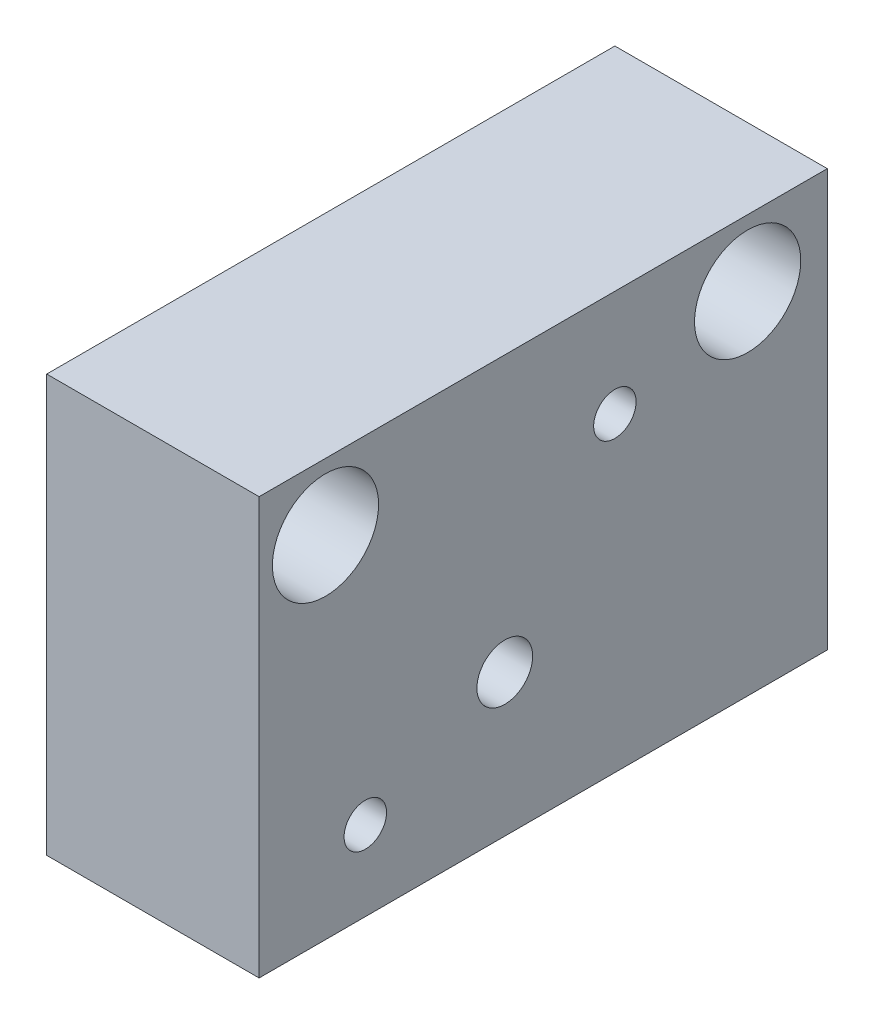
ISO-10303-21;
HEADER;
FILE_DESCRIPTION(('STEP AP214'),'2;1');
FILE_NAME('part.step','',(''),(''),'','','');
FILE_SCHEMA(('AUTOMOTIVE_DESIGN { 1 0 10303 214 1 1 1 1 }'));
ENDSEC;
DATA;
#1=APPLICATION_CONTEXT('core data for automotive mechanical design processes');
#2=APPLICATION_PROTOCOL_DEFINITION('international standard','automotive_design',2000,#1);
#3=PRODUCT_CONTEXT('',#1,'mechanical');
#4=PRODUCT('Part','Part','',(#3));
#5=PRODUCT_RELATED_PRODUCT_CATEGORY('part','',(#4));
#6=PRODUCT_DEFINITION_FORMATION('','',#4);
#7=PRODUCT_DEFINITION_CONTEXT('part definition',#1,'design');
#8=PRODUCT_DEFINITION('design','',#6,#7);
#9=PRODUCT_DEFINITION_SHAPE('','',#8);
#10=(LENGTH_UNIT() NAMED_UNIT(*) SI_UNIT(.MILLI.,.METRE.));
#11=(NAMED_UNIT(*) PLANE_ANGLE_UNIT() SI_UNIT($,.RADIAN.));
#12=(NAMED_UNIT(*) SI_UNIT($,.STERADIAN.) SOLID_ANGLE_UNIT());
#13=UNCERTAINTY_MEASURE_WITH_UNIT(LENGTH_MEASURE(1.E-05),#10,'distance_accuracy_value','');
#14=(GEOMETRIC_REPRESENTATION_CONTEXT(3) GLOBAL_UNCERTAINTY_ASSIGNED_CONTEXT((#13)) GLOBAL_UNIT_ASSIGNED_CONTEXT((#10,
#11,#12)) REPRESENTATION_CONTEXT('',''));
#15=CARTESIAN_POINT('',(0.,0.,0.));
#16=DIRECTION('',(0.,0.,1.));
#17=DIRECTION('',(1.,0.,0.));
#18=AXIS2_PLACEMENT_3D('',#15,#16,#17);
#19=CARTESIAN_POINT('',(-4.,-35.7,13.9));
#20=DIRECTION('',(-1.,0.,0.));
#21=DIRECTION('',(0.,0.,1.));
#22=AXIS2_PLACEMENT_3D('',#19,#20,#21);
#23=PLANE('',#22);
#24=CARTESIAN_POINT('',(-4.,-22.5,11.4));
#25=DIRECTION('',(-1.,0.,0.));
#26=DIRECTION('',(0.,0.,-1.));
#27=AXIS2_PLACEMENT_3D('',#24,#25,#26);
#28=CIRCLE('',#27,1.5);
#29=CARTESIAN_POINT('',(-4.,-22.5,9.9));
#30=VERTEX_POINT('',#29);
#31=EDGE_CURVE('E117',#30,#30,#28,.T.);
#32=ORIENTED_EDGE('',*,*,#31,.F.);
#33=EDGE_LOOP('',(#32));
#34=FACE_BOUND('',#33,.T.);
#35=CARTESIAN_POINT('',(-4.,-22.5,-4.5));
#36=DIRECTION('',(-1.,0.,0.));
#37=DIRECTION('',(0.,0.,-1.));
#38=AXIS2_PLACEMENT_3D('',#35,#36,#37);
#39=CIRCLE('',#38,1.5);
#40=CARTESIAN_POINT('',(-4.,-22.5,-6.));
#41=VERTEX_POINT('',#40);
#42=EDGE_CURVE('E123',#41,#41,#39,.T.);
#43=ORIENTED_EDGE('',*,*,#42,.F.);
#44=EDGE_LOOP('',(#43));
#45=FACE_BOUND('',#44,.T.);
#46=CARTESIAN_POINT('',(-4.,-30.3502973700561,4.64682698815077));
#47=DIRECTION('',(1.,0.,0.));
#48=DIRECTION('',(0.,0.,1.));
#49=AXIS2_PLACEMENT_3D('',#46,#47,#48);
#50=CIRCLE('',#49,1.05);
#51=CARTESIAN_POINT('',(-4.,-30.3502973700561,5.69682698815077));
#52=VERTEX_POINT('',#51);
#53=EDGE_CURVE('E141',#52,#52,#50,.T.);
#54=ORIENTED_EDGE('',*,*,#53,.T.);
#55=EDGE_LOOP('',(#54));
#56=FACE_BOUND('',#55,.T.);
#57=DIRECTION('',(0.,0.,-1.));
#58=VECTOR('',#57,1.);
#59=CARTESIAN_POINT('',(-4.,-20.,13.9));
#60=LINE('',#59,#58);
#61=CARTESIAN_POINT('',(-4.,-20.,13.9));
#62=VERTEX_POINT('',#61);
#63=CARTESIAN_POINT('',(-4.,-20.,-7.5));
#64=VERTEX_POINT('',#63);
#65=EDGE_CURVE('E107',#62,#64,#60,.T.);
#66=ORIENTED_EDGE('',*,*,#65,.T.);
#67=DIRECTION('',(0.,1.,0.));
#68=VECTOR('',#67,1.);
#69=CARTESIAN_POINT('',(-4.,-35.7,-7.5));
#70=LINE('',#69,#68);
#71=CARTESIAN_POINT('',(-4.,-35.7,-7.5));
#72=VERTEX_POINT('',#71);
#73=EDGE_CURVE('E100',#72,#64,#70,.T.);
#74=ORIENTED_EDGE('',*,*,#73,.F.);
#75=DIRECTION('',(0.,0.,-1.));
#76=VECTOR('',#75,1.);
#77=CARTESIAN_POINT('',(-4.,-35.7,13.9));
#78=LINE('',#77,#76);
#79=CARTESIAN_POINT('',(-4.,-35.7,13.9));
#80=VERTEX_POINT('',#79);
#81=EDGE_CURVE('E94',#80,#72,#78,.T.);
#82=ORIENTED_EDGE('',*,*,#81,.F.);
#83=DIRECTION('',(0.,1.,0.));
#84=VECTOR('',#83,1.);
#85=CARTESIAN_POINT('',(-4.,-35.7,13.9));
#86=LINE('',#85,#84);
#87=EDGE_CURVE('E12',#80,#62,#86,.T.);
#88=ORIENTED_EDGE('',*,*,#87,.T.);
#89=EDGE_LOOP('',(#66,#74,#82,#88));
#90=FACE_BOUND('',#89,.T.);
#91=ADVANCED_FACE('F41',(#34,#45,#56,#90),#23,.T.);
#92=CARTESIAN_POINT('',(-4.,-35.7,13.9));
#93=DIRECTION('',(0.,0.,-1.));
#94=DIRECTION('',(-1.,0.,0.));
#95=AXIS2_PLACEMENT_3D('',#92,#93,#94);
#96=PLANE('',#95);
#97=DIRECTION('',(1.,0.,0.));
#98=VECTOR('',#97,1.);
#99=CARTESIAN_POINT('',(-4.,-20.,13.9));
#100=LINE('',#99,#98);
#101=CARTESIAN_POINT('',(4.,-20.,13.9));
#102=VERTEX_POINT('',#101);
#103=EDGE_CURVE('E82',#62,#102,#100,.T.);
#104=ORIENTED_EDGE('',*,*,#103,.F.);
#105=ORIENTED_EDGE('',*,*,#87,.F.);
#106=DIRECTION('',(1.,0.,0.));
#107=VECTOR('',#106,1.);
#108=CARTESIAN_POINT('',(-4.,-35.7,13.9));
#109=LINE('',#108,#107);
#110=CARTESIAN_POINT('',(4.,-35.7,13.9));
#111=VERTEX_POINT('',#110);
#112=EDGE_CURVE('E59',#80,#111,#109,.T.);
#113=ORIENTED_EDGE('',*,*,#112,.T.);
#114=DIRECTION('',(0.,1.,0.));
#115=VECTOR('',#114,1.);
#116=CARTESIAN_POINT('',(4.,-35.7,13.9));
#117=LINE('',#116,#115);
#118=EDGE_CURVE('E50',#111,#102,#117,.T.);
#119=ORIENTED_EDGE('',*,*,#118,.T.);
#120=EDGE_LOOP('',(#104,#105,#113,#119));
#121=FACE_BOUND('',#120,.T.);
#122=ADVANCED_FACE('F170',(#121),#96,.F.);
#123=CARTESIAN_POINT('',(4.,-35.7,13.9));
#124=DIRECTION('',(-1.,0.,0.));
#125=DIRECTION('',(0.,0.,1.));
#126=AXIS2_PLACEMENT_3D('',#123,#124,#125);
#127=PLANE('',#126);
#128=CARTESIAN_POINT('',(4.,-32.7,9.9));
#129=DIRECTION('',(-1.,0.,0.));
#130=DIRECTION('',(0.,0.,-1.));
#131=AXIS2_PLACEMENT_3D('',#128,#129,#130);
#132=CIRCLE('',#131,0.800000000000001);
#133=CARTESIAN_POINT('',(4.,-32.7,9.1));
#134=VERTEX_POINT('',#133);
#135=EDGE_CURVE('E314',#134,#134,#132,.T.);
#136=ORIENTED_EDGE('',*,*,#135,.T.);
#137=EDGE_LOOP('',(#136));
#138=FACE_BOUND('',#137,.T.);
#139=CARTESIAN_POINT('',(4.,-24.,0.5));
#140=DIRECTION('',(-1.,0.,0.));
#141=DIRECTION('',(0.,0.,-1.));
#142=AXIS2_PLACEMENT_3D('',#139,#140,#141);
#143=CIRCLE('',#142,0.800000000000001);
#144=CARTESIAN_POINT('',(4.,-24.,-0.300000000000001));
#145=VERTEX_POINT('',#144);
#146=EDGE_CURVE('E317',#145,#145,#143,.T.);
#147=ORIENTED_EDGE('',*,*,#146,.T.);
#148=EDGE_LOOP('',(#147));
#149=FACE_BOUND('',#148,.T.);
#150=CARTESIAN_POINT('',(4.,-22.5,-4.5));
#151=DIRECTION('',(-1.,0.,0.));
#152=DIRECTION('',(0.,0.,-1.));
#153=AXIS2_PLACEMENT_3D('',#150,#151,#152);
#154=CIRCLE('',#153,2.);
#155=CARTESIAN_POINT('',(4.,-22.5,-6.5));
#156=VERTEX_POINT('',#155);
#157=EDGE_CURVE('E134',#156,#156,#154,.T.);
#158=ORIENTED_EDGE('',*,*,#157,.T.);
#159=EDGE_LOOP('',(#158));
#160=FACE_BOUND('',#159,.T.);
#161=CARTESIAN_POINT('',(4.,-22.5,11.4));
#162=DIRECTION('',(-1.,0.,0.));
#163=DIRECTION('',(0.,0.,-1.));
#164=AXIS2_PLACEMENT_3D('',#161,#162,#163);
#165=CIRCLE('',#164,2.);
#166=CARTESIAN_POINT('',(4.,-22.5,9.4));
#167=VERTEX_POINT('',#166);
#168=EDGE_CURVE('E138',#167,#167,#165,.T.);
#169=ORIENTED_EDGE('',*,*,#168,.T.);
#170=EDGE_LOOP('',(#169));
#171=FACE_BOUND('',#170,.T.);
#172=CARTESIAN_POINT('',(4.,-30.3502973700561,4.64682698815077));
#173=DIRECTION('',(1.,0.,0.));
#174=DIRECTION('',(0.,0.,1.));
#175=AXIS2_PLACEMENT_3D('',#172,#173,#174);
#176=CIRCLE('',#175,1.05);
#177=CARTESIAN_POINT('',(4.,-30.3502973700561,5.69682698815077));
#178=VERTEX_POINT('',#177);
#179=EDGE_CURVE('E146',#178,#178,#176,.T.);
#180=ORIENTED_EDGE('',*,*,#179,.F.);
#181=EDGE_LOOP('',(#180));
#182=FACE_BOUND('',#181,.T.);
#183=DIRECTION('',(0.,0.,-1.));
#184=VECTOR('',#183,1.);
#185=CARTESIAN_POINT('',(4.,-20.,13.9));
#186=LINE('',#185,#184);
#187=CARTESIAN_POINT('',(4.,-20.,-7.5));
#188=VERTEX_POINT('',#187);
#189=EDGE_CURVE('E76',#102,#188,#186,.T.);
#190=ORIENTED_EDGE('',*,*,#189,.F.);
#191=ORIENTED_EDGE('',*,*,#118,.F.);
#192=DIRECTION('',(0.,0.,-1.));
#193=VECTOR('',#192,1.);
#194=CARTESIAN_POINT('',(4.,-35.7,13.9));
#195=LINE('',#194,#193);
#196=CARTESIAN_POINT('',(4.,-35.7,-7.5));
#197=VERTEX_POINT('',#196);
#198=EDGE_CURVE('E92',#111,#197,#195,.T.);
#199=ORIENTED_EDGE('',*,*,#198,.T.);
#200=DIRECTION('',(0.,1.,0.));
#201=VECTOR('',#200,1.);
#202=CARTESIAN_POINT('',(4.,-35.7,-7.5));
#203=LINE('',#202,#201);
#204=EDGE_CURVE('E97',#197,#188,#203,.T.);
#205=ORIENTED_EDGE('',*,*,#204,.T.);
#206=EDGE_LOOP('',(#190,#191,#199,#205));
#207=FACE_BOUND('',#206,.T.);
#208=ADVANCED_FACE('F102',(#138,#149,#160,#171,#182,#207),#127,.F.);
#209=CARTESIAN_POINT('',(-4.,-35.7,-7.5));
#210=DIRECTION('',(0.,0.,-1.));
#211=DIRECTION('',(-1.,0.,0.));
#212=AXIS2_PLACEMENT_3D('',#209,#210,#211);
#213=PLANE('',#212);
#214=DIRECTION('',(1.,0.,0.));
#215=VECTOR('',#214,1.);
#216=CARTESIAN_POINT('',(-4.,-20.,-7.5));
#217=LINE('',#216,#215);
#218=EDGE_CURVE('E99',#64,#188,#217,.T.);
#219=ORIENTED_EDGE('',*,*,#218,.T.);
#220=ORIENTED_EDGE('',*,*,#204,.F.);
#221=DIRECTION('',(1.,0.,0.));
#222=VECTOR('',#221,1.);
#223=CARTESIAN_POINT('',(-4.,-35.7,-7.5));
#224=LINE('',#223,#222);
#225=EDGE_CURVE('E89',#72,#197,#224,.T.);
#226=ORIENTED_EDGE('',*,*,#225,.F.);
#227=ORIENTED_EDGE('',*,*,#73,.T.);
#228=EDGE_LOOP('',(#219,#220,#226,#227));
#229=FACE_BOUND('',#228,.T.);
#230=ADVANCED_FACE('F98',(#229),#213,.T.);
#231=CARTESIAN_POINT('',(0.,-35.7,0.));
#232=DIRECTION('',(0.,1.,0.));
#233=DIRECTION('',(0.,0.,-1.));
#234=AXIS2_PLACEMENT_3D('',#231,#232,#233);
#235=PLANE('',#234);
#236=CARTESIAN_POINT('',(0.,-35.7,0.));
#237=DIRECTION('',(0.,-1.,0.));
#238=DIRECTION('',(0.,0.,-1.));
#239=AXIS2_PLACEMENT_3D('',#236,#237,#238);
#240=CIRCLE('',#239,2.6);
#241=CARTESIAN_POINT('',(0.,-35.7,-2.6));
#242=VERTEX_POINT('',#241);
#243=EDGE_CURVE('E149',#242,#242,#240,.T.);
#244=ORIENTED_EDGE('',*,*,#243,.F.);
#245=EDGE_LOOP('',(#244));
#246=FACE_BOUND('',#245,.T.);
#247=ORIENTED_EDGE('',*,*,#81,.T.);
#248=ORIENTED_EDGE('',*,*,#225,.T.);
#249=ORIENTED_EDGE('',*,*,#198,.F.);
#250=ORIENTED_EDGE('',*,*,#112,.F.);
#251=EDGE_LOOP('',(#247,#248,#249,#250));
#252=FACE_BOUND('',#251,.T.);
#253=ADVANCED_FACE('F90',(#246,#252),#235,.F.);
#254=CARTESIAN_POINT('',(0.,-20.,0.));
#255=DIRECTION('',(0.,1.,0.));
#256=DIRECTION('',(0.,0.,-1.));
#257=AXIS2_PLACEMENT_3D('',#254,#255,#256);
#258=PLANE('',#257);
#259=ORIENTED_EDGE('',*,*,#65,.F.);
#260=ORIENTED_EDGE('',*,*,#103,.T.);
#261=ORIENTED_EDGE('',*,*,#189,.T.);
#262=ORIENTED_EDGE('',*,*,#218,.F.);
#263=EDGE_LOOP('',(#259,#260,#261,#262));
#264=FACE_BOUND('',#263,.T.);
#265=ADVANCED_FACE('F160',(#264),#258,.T.);
#266=CARTESIAN_POINT('',(0.,-33.1,0.));
#267=DIRECTION('',(0.,-1.,0.));
#268=DIRECTION('',(0.,0.,1.));
#269=AXIS2_PLACEMENT_3D('',#266,#267,#268);
#270=CYLINDRICAL_SURFACE('',#269,2.6);
#271=CARTESIAN_POINT('',(0.,-33.1,0.));
#272=DIRECTION('',(0.,-1.,0.));
#273=DIRECTION('',(0.,0.,-1.));
#274=AXIS2_PLACEMENT_3D('',#271,#272,#273);
#275=CIRCLE('',#274,2.6);
#276=CARTESIAN_POINT('',(0.,-33.1,-2.6));
#277=VERTEX_POINT('',#276);
#278=EDGE_CURVE('E110',#277,#277,#275,.T.);
#279=ORIENTED_EDGE('',*,*,#278,.F.);
#280=EDGE_LOOP('',(#279));
#281=FACE_BOUND('',#280,.T.);
#282=ORIENTED_EDGE('',*,*,#243,.T.);
#283=EDGE_LOOP('',(#282));
#284=FACE_BOUND('',#283,.T.);
#285=ADVANCED_FACE('F157',(#281,#284),#270,.F.);
#286=CARTESIAN_POINT('',(0.,-33.1,0.));
#287=DIRECTION('',(0.,1.,0.));
#288=DIRECTION('',(0.,0.,-1.));
#289=AXIS2_PLACEMENT_3D('',#286,#287,#288);
#290=PLANE('',#289);
#291=ORIENTED_EDGE('',*,*,#278,.T.);
#292=EDGE_LOOP('',(#291));
#293=FACE_BOUND('',#292,.T.);
#294=ADVANCED_FACE('F186',(#293),#290,.F.);
#295=CARTESIAN_POINT('',(4.,-30.3502973700561,4.64682698815077));
#296=DIRECTION('',(-1.,0.,0.));
#297=DIRECTION('',(0.,0.,1.));
#298=AXIS2_PLACEMENT_3D('',#295,#296,#297);
#299=CYLINDRICAL_SURFACE('',#298,1.05);
#300=ORIENTED_EDGE('',*,*,#179,.T.);
#301=EDGE_LOOP('',(#300));
#302=FACE_BOUND('',#301,.T.);
#303=ORIENTED_EDGE('',*,*,#53,.F.);
#304=EDGE_LOOP('',(#303));
#305=FACE_BOUND('',#304,.T.);
#306=ADVANCED_FACE('F183',(#302,#305),#299,.F.);
#307=CARTESIAN_POINT('',(-2.,-35.7,13.9));
#308=DIRECTION('',(-1.,0.,0.));
#309=DIRECTION('',(0.,0.,1.));
#310=AXIS2_PLACEMENT_3D('',#307,#308,#309);
#311=PLANE('',#310);
#312=CARTESIAN_POINT('',(-2.,-22.5,11.4));
#313=DIRECTION('',(1.,0.,0.));
#314=DIRECTION('',(0.,0.,1.));
#315=AXIS2_PLACEMENT_3D('',#312,#313,#314);
#316=CIRCLE('',#315,1.5);
#317=CARTESIAN_POINT('',(-2.,-22.5,12.9));
#318=VERTEX_POINT('',#317);
#319=EDGE_CURVE('E44',#318,#318,#316,.T.);
#320=ORIENTED_EDGE('',*,*,#319,.F.);
#321=EDGE_LOOP('',(#320));
#322=FACE_BOUND('',#321,.T.);
#323=CARTESIAN_POINT('',(-2.,-22.5,11.4));
#324=DIRECTION('',(1.,0.,0.));
#325=DIRECTION('',(0.,0.,1.));
#326=AXIS2_PLACEMENT_3D('',#323,#324,#325);
#327=CIRCLE('',#326,2.);
#328=CARTESIAN_POINT('',(-2.,-22.5,13.4));
#329=VERTEX_POINT('',#328);
#330=EDGE_CURVE('E121',#329,#329,#327,.F.);
#331=ORIENTED_EDGE('',*,*,#330,.F.);
#332=EDGE_LOOP('',(#331));
#333=FACE_BOUND('',#332,.T.);
#334=ADVANCED_FACE('F185',(#322,#333),#311,.F.);
#335=CARTESIAN_POINT('',(-9.65685424949238,-22.5,11.4));
#336=DIRECTION('',(1.,0.,0.));
#337=DIRECTION('',(0.,0.,-1.));
#338=AXIS2_PLACEMENT_3D('',#335,#336,#337);
#339=CYLINDRICAL_SURFACE('',#338,2.);
#340=ORIENTED_EDGE('',*,*,#168,.F.);
#341=EDGE_LOOP('',(#340));
#342=FACE_BOUND('',#341,.T.);
#343=ORIENTED_EDGE('',*,*,#330,.T.);
#344=EDGE_LOOP('',(#343));
#345=FACE_BOUND('',#344,.T.);
#346=ADVANCED_FACE('F193',(#342,#345),#339,.F.);
#347=CARTESIAN_POINT('',(-2.,-35.7,13.9));
#348=DIRECTION('',(-1.,0.,0.));
#349=DIRECTION('',(0.,0.,1.));
#350=AXIS2_PLACEMENT_3D('',#347,#348,#349);
#351=PLANE('',#350);
#352=CARTESIAN_POINT('',(-2.,-22.5,-4.5));
#353=DIRECTION('',(1.,0.,0.));
#354=DIRECTION('',(0.,0.,1.));
#355=AXIS2_PLACEMENT_3D('',#352,#353,#354);
#356=CIRCLE('',#355,1.5);
#357=CARTESIAN_POINT('',(-2.,-22.5,-3.));
#358=VERTEX_POINT('',#357);
#359=EDGE_CURVE('E115',#358,#358,#356,.T.);
#360=ORIENTED_EDGE('',*,*,#359,.F.);
#361=EDGE_LOOP('',(#360));
#362=FACE_BOUND('',#361,.T.);
#363=CARTESIAN_POINT('',(-2.,-22.5,-4.5));
#364=DIRECTION('',(1.,0.,0.));
#365=DIRECTION('',(0.,0.,1.));
#366=AXIS2_PLACEMENT_3D('',#363,#364,#365);
#367=CIRCLE('',#366,2.);
#368=CARTESIAN_POINT('',(-2.,-22.5,-2.5));
#369=VERTEX_POINT('',#368);
#370=EDGE_CURVE('E137',#369,#369,#367,.F.);
#371=ORIENTED_EDGE('',*,*,#370,.F.);
#372=EDGE_LOOP('',(#371));
#373=FACE_BOUND('',#372,.T.);
#374=ADVANCED_FACE('F231',(#362,#373),#351,.F.);
#375=CARTESIAN_POINT('',(-9.65685424949238,-22.5,-4.5));
#376=DIRECTION('',(1.,0.,0.));
#377=DIRECTION('',(0.,0.,-1.));
#378=AXIS2_PLACEMENT_3D('',#375,#376,#377);
#379=CYLINDRICAL_SURFACE('',#378,2.);
#380=ORIENTED_EDGE('',*,*,#157,.F.);
#381=EDGE_LOOP('',(#380));
#382=FACE_BOUND('',#381,.T.);
#383=ORIENTED_EDGE('',*,*,#370,.T.);
#384=EDGE_LOOP('',(#383));
#385=FACE_BOUND('',#384,.T.);
#386=ADVANCED_FACE('F240',(#382,#385),#379,.F.);
#387=CARTESIAN_POINT('',(-4.,-22.5,-4.5));
#388=DIRECTION('',(1.,0.,0.));
#389=DIRECTION('',(0.,0.,-1.));
#390=AXIS2_PLACEMENT_3D('',#387,#388,#389);
#391=CYLINDRICAL_SURFACE('',#390,1.5);
#392=ORIENTED_EDGE('',*,*,#42,.T.);
#393=EDGE_LOOP('',(#392));
#394=FACE_BOUND('',#393,.T.);
#395=ORIENTED_EDGE('',*,*,#359,.T.);
#396=EDGE_LOOP('',(#395));
#397=FACE_BOUND('',#396,.T.);
#398=ADVANCED_FACE('F250',(#394,#397),#391,.F.);
#399=CARTESIAN_POINT('',(-4.,-22.5,11.4));
#400=DIRECTION('',(1.,0.,0.));
#401=DIRECTION('',(0.,0.,-1.));
#402=AXIS2_PLACEMENT_3D('',#399,#400,#401);
#403=CYLINDRICAL_SURFACE('',#402,1.5);
#404=ORIENTED_EDGE('',*,*,#31,.T.);
#405=EDGE_LOOP('',(#404));
#406=FACE_BOUND('',#405,.T.);
#407=ORIENTED_EDGE('',*,*,#319,.T.);
#408=EDGE_LOOP('',(#407));
#409=FACE_BOUND('',#408,.T.);
#410=ADVANCED_FACE('F260',(#406,#409),#403,.F.);
#411=CARTESIAN_POINT('',(0.,-24.,0.5));
#412=DIRECTION('',(1.,0.,0.));
#413=DIRECTION('',(0.,0.,-1.));
#414=AXIS2_PLACEMENT_3D('',#411,#412,#413);
#415=CYLINDRICAL_SURFACE('',#414,0.800000000000001);
#416=CARTESIAN_POINT('',(0.,-24.,0.5));
#417=DIRECTION('',(-1.,0.,0.));
#418=DIRECTION('',(0.,0.,-1.));
#419=AXIS2_PLACEMENT_3D('',#416,#417,#418);
#420=CIRCLE('',#419,0.800000000000001);
#421=CARTESIAN_POINT('',(0.,-24.,-0.300000000000001));
#422=VERTEX_POINT('',#421);
#423=EDGE_CURVE('E131',#422,#422,#420,.T.);
#424=ORIENTED_EDGE('',*,*,#423,.T.);
#425=EDGE_LOOP('',(#424));
#426=FACE_BOUND('',#425,.T.);
#427=ORIENTED_EDGE('',*,*,#146,.F.);
#428=EDGE_LOOP('',(#427));
#429=FACE_BOUND('',#428,.T.);
#430=ADVANCED_FACE('F270',(#426,#429),#415,.F.);
#431=CARTESIAN_POINT('',(0.,-24.,0.5));
#432=DIRECTION('',(1.,0.,0.));
#433=DIRECTION('',(0.,0.,-1.));
#434=AXIS2_PLACEMENT_3D('',#431,#432,#433);
#435=PLANE('',#434);
#436=ORIENTED_EDGE('',*,*,#423,.F.);
#437=EDGE_LOOP('',(#436));
#438=FACE_BOUND('',#437,.T.);
#439=ADVANCED_FACE('F279',(#438),#435,.T.);
#440=CARTESIAN_POINT('',(0.,-32.7,9.9));
#441=DIRECTION('',(1.,0.,0.));
#442=DIRECTION('',(0.,0.,-1.));
#443=AXIS2_PLACEMENT_3D('',#440,#441,#442);
#444=CYLINDRICAL_SURFACE('',#443,0.800000000000001);
#445=CARTESIAN_POINT('',(0.,-32.7,9.9));
#446=DIRECTION('',(-1.,0.,0.));
#447=DIRECTION('',(0.,0.,-1.));
#448=AXIS2_PLACEMENT_3D('',#445,#446,#447);
#449=CIRCLE('',#448,0.800000000000001);
#450=CARTESIAN_POINT('',(0.,-32.7,9.1));
#451=VERTEX_POINT('',#450);
#452=EDGE_CURVE('E128',#451,#451,#449,.T.);
#453=ORIENTED_EDGE('',*,*,#452,.T.);
#454=EDGE_LOOP('',(#453));
#455=FACE_BOUND('',#454,.T.);
#456=ORIENTED_EDGE('',*,*,#135,.F.);
#457=EDGE_LOOP('',(#456));
#458=FACE_BOUND('',#457,.T.);
#459=ADVANCED_FACE('F289',(#455,#458),#444,.F.);
#460=CARTESIAN_POINT('',(0.,-32.7,9.9));
#461=DIRECTION('',(1.,0.,0.));
#462=DIRECTION('',(0.,0.,-1.));
#463=AXIS2_PLACEMENT_3D('',#460,#461,#462);
#464=PLANE('',#463);
#465=ORIENTED_EDGE('',*,*,#452,.F.);
#466=EDGE_LOOP('',(#465));
#467=FACE_BOUND('',#466,.T.);
#468=ADVANCED_FACE('F299',(#467),#464,.T.);
#469=CLOSED_SHELL('',(#91,#122,#208,#230,#253,#265,#285,#294,#306,#334,#346,#374,#386,#398,#410,
#430,#439,#459,#468));
#470=MANIFOLD_SOLID_BREP('B2',#469);
#471=ADVANCED_BREP_SHAPE_REPRESENTATION('',(#18,#470),#14);
#472=SHAPE_DEFINITION_REPRESENTATION(#9,#471);
ENDSEC;
END-ISO-10303-21;
